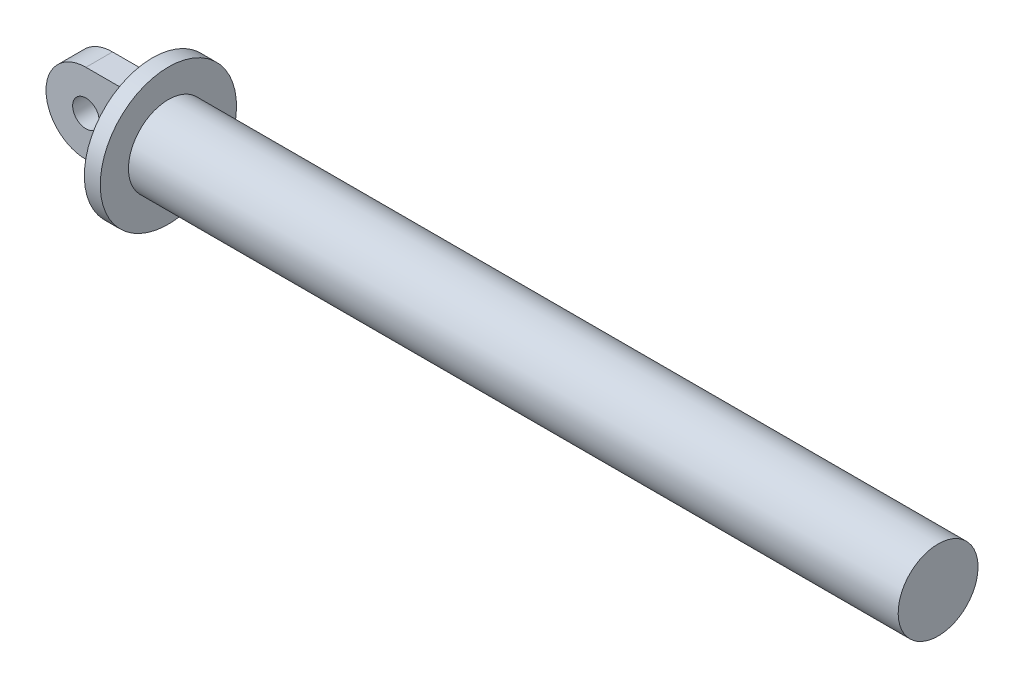
ISO-10303-21;
HEADER;
FILE_DESCRIPTION(('STEP AP214'),'2;1');
FILE_NAME('part.step','',(''),(''),'','','');
FILE_SCHEMA(('AUTOMOTIVE_DESIGN { 1 0 10303 214 1 1 1 1 }'));
ENDSEC;
DATA;
#1=APPLICATION_CONTEXT('core data for automotive mechanical design processes');
#2=APPLICATION_PROTOCOL_DEFINITION('international standard','automotive_design',2000,#1);
#3=PRODUCT_CONTEXT('',#1,'mechanical');
#4=PRODUCT('Part','Part','',(#3));
#5=PRODUCT_RELATED_PRODUCT_CATEGORY('part','',(#4));
#6=PRODUCT_DEFINITION_FORMATION('','',#4);
#7=PRODUCT_DEFINITION_CONTEXT('part definition',#1,'design');
#8=PRODUCT_DEFINITION('design','',#6,#7);
#9=PRODUCT_DEFINITION_SHAPE('','',#8);
#10=(LENGTH_UNIT() NAMED_UNIT(*) SI_UNIT(.MILLI.,.METRE.));
#11=(NAMED_UNIT(*) PLANE_ANGLE_UNIT() SI_UNIT($,.RADIAN.));
#12=(NAMED_UNIT(*) SI_UNIT($,.STERADIAN.) SOLID_ANGLE_UNIT());
#13=UNCERTAINTY_MEASURE_WITH_UNIT(LENGTH_MEASURE(1.E-05),#10,'distance_accuracy_value','');
#14=(GEOMETRIC_REPRESENTATION_CONTEXT(3) GLOBAL_UNCERTAINTY_ASSIGNED_CONTEXT((#13)) GLOBAL_UNIT_ASSIGNED_CONTEXT((#10,
#11,#12)) REPRESENTATION_CONTEXT('',''));
#15=CARTESIAN_POINT('',(0.,0.,0.));
#16=DIRECTION('',(0.,0.,1.));
#17=DIRECTION('',(1.,0.,0.));
#18=AXIS2_PLACEMENT_3D('',#15,#16,#17);
#19=CARTESIAN_POINT('',(-25.9823415505556,13.4020243973581,5.));
#20=DIRECTION('',(0.,0.,1.));
#21=DIRECTION('',(1.,0.,0.));
#22=AXIS2_PLACEMENT_3D('',#19,#20,#21);
#23=PLANE('',#22);
#24=CARTESIAN_POINT('',(-25.9823415505556,13.4020243973581,5.));
#25=DIRECTION('',(0.,0.,1.));
#26=DIRECTION('',(1.,0.,0.));
#27=AXIS2_PLACEMENT_3D('',#24,#25,#26);
#28=CIRCLE('',#27,15.);
#29=CARTESIAN_POINT('',(-25.9823415505556,28.4020243973581,5.));
#30=VERTEX_POINT('',#29);
#31=CARTESIAN_POINT('',(-25.9823415505556,-1.59797560264188,5.));
#32=VERTEX_POINT('',#31);
#33=EDGE_CURVE('E103',#30,#32,#28,.T.);
#34=ORIENTED_EDGE('',*,*,#33,.T.);
#35=DIRECTION('',(1.,0.,0.));
#36=VECTOR('',#35,1.);
#37=CARTESIAN_POINT('',(-25.9823415505556,-1.59797560264188,5.));
#38=LINE('',#37,#36);
#39=CARTESIAN_POINT('',(-5.9823415505556,-1.59797560264188,5.));
#40=VERTEX_POINT('',#39);
#41=EDGE_CURVE('E76',#32,#40,#38,.T.);
#42=ORIENTED_EDGE('',*,*,#41,.T.);
#43=DIRECTION('',(0.,1.,0.));
#44=VECTOR('',#43,1.);
#45=CARTESIAN_POINT('',(-5.98234155055561,28.4020243973581,5.));
#46=LINE('',#45,#44);
#47=CARTESIAN_POINT('',(-5.98234155055561,28.4020243973581,5.));
#48=VERTEX_POINT('',#47);
#49=EDGE_CURVE('E98',#40,#48,#46,.T.);
#50=ORIENTED_EDGE('',*,*,#49,.T.);
#51=DIRECTION('',(-1.,0.,0.));
#52=VECTOR('',#51,1.);
#53=CARTESIAN_POINT('',(-25.9823415505556,28.4020243973581,5.));
#54=LINE('',#53,#52);
#55=EDGE_CURVE('E52',#48,#30,#54,.T.);
#56=ORIENTED_EDGE('',*,*,#55,.T.);
#57=EDGE_LOOP('',(#34,#42,#50,#56));
#58=FACE_BOUND('',#57,.T.);
#59=CARTESIAN_POINT('',(-25.9823415505556,13.4020243973581,5.));
#60=DIRECTION('',(0.,0.,1.));
#61=DIRECTION('',(1.,0.,0.));
#62=AXIS2_PLACEMENT_3D('',#59,#60,#61);
#63=CIRCLE('',#62,5.);
#64=CARTESIAN_POINT('',(-20.9823415505556,13.4020243973581,5.));
#65=VERTEX_POINT('',#64);
#66=EDGE_CURVE('E106',#65,#65,#63,.T.);
#67=ORIENTED_EDGE('',*,*,#66,.F.);
#68=EDGE_LOOP('',(#67));
#69=FACE_BOUND('',#68,.T.);
#70=ADVANCED_FACE('F35',(#58,#69),#23,.T.);
#71=CARTESIAN_POINT('',(-25.9823415505556,13.4020243973581,-5.));
#72=DIRECTION('',(0.,0.,1.));
#73=DIRECTION('',(1.,0.,0.));
#74=AXIS2_PLACEMENT_3D('',#71,#72,#73);
#75=PLANE('',#74);
#76=CARTESIAN_POINT('',(-25.9823415505556,13.4020243973581,-5.));
#77=DIRECTION('',(0.,0.,1.));
#78=DIRECTION('',(1.,0.,0.));
#79=AXIS2_PLACEMENT_3D('',#76,#77,#78);
#80=CIRCLE('',#79,15.);
#81=CARTESIAN_POINT('',(-25.9823415505556,28.4020243973581,-5.));
#82=VERTEX_POINT('',#81);
#83=CARTESIAN_POINT('',(-25.9823415505556,-1.59797560264188,-5.));
#84=VERTEX_POINT('',#83);
#85=EDGE_CURVE('E94',#82,#84,#80,.T.);
#86=ORIENTED_EDGE('',*,*,#85,.F.);
#87=DIRECTION('',(-1.,0.,0.));
#88=VECTOR('',#87,1.);
#89=CARTESIAN_POINT('',(-25.9823415505556,28.4020243973581,-5.));
#90=LINE('',#89,#88);
#91=CARTESIAN_POINT('',(-5.98234155055561,28.4020243973581,-5.));
#92=VERTEX_POINT('',#91);
#93=EDGE_CURVE('E69',#92,#82,#90,.T.);
#94=ORIENTED_EDGE('',*,*,#93,.F.);
#95=DIRECTION('',(0.,1.,0.));
#96=VECTOR('',#95,1.);
#97=CARTESIAN_POINT('',(-5.98234155055561,28.4020243973581,-5.));
#98=LINE('',#97,#96);
#99=CARTESIAN_POINT('',(-5.9823415505556,-1.59797560264188,-5.));
#100=VERTEX_POINT('',#99);
#101=EDGE_CURVE('E81',#100,#92,#98,.T.);
#102=ORIENTED_EDGE('',*,*,#101,.F.);
#103=DIRECTION('',(1.,0.,0.));
#104=VECTOR('',#103,1.);
#105=CARTESIAN_POINT('',(-25.9823415505556,-1.59797560264188,-5.));
#106=LINE('',#105,#104);
#107=EDGE_CURVE('E86',#84,#100,#106,.T.);
#108=ORIENTED_EDGE('',*,*,#107,.F.);
#109=EDGE_LOOP('',(#86,#94,#102,#108));
#110=FACE_BOUND('',#109,.T.);
#111=CARTESIAN_POINT('',(-25.9823415505556,13.4020243973581,-5.));
#112=DIRECTION('',(0.,0.,1.));
#113=DIRECTION('',(1.,0.,0.));
#114=AXIS2_PLACEMENT_3D('',#111,#112,#113);
#115=CIRCLE('',#114,5.);
#116=CARTESIAN_POINT('',(-20.9823415505556,13.4020243973581,-5.));
#117=VERTEX_POINT('',#116);
#118=EDGE_CURVE('E111',#117,#117,#115,.T.);
#119=ORIENTED_EDGE('',*,*,#118,.T.);
#120=EDGE_LOOP('',(#119));
#121=FACE_BOUND('',#120,.T.);
#122=ADVANCED_FACE('F84',(#110,#121),#75,.F.);
#123=CARTESIAN_POINT('',(-25.9823415505556,13.4020243973581,5.));
#124=DIRECTION('',(0.,0.,-1.));
#125=DIRECTION('',(-1.,0.,0.));
#126=AXIS2_PLACEMENT_3D('',#123,#124,#125);
#127=CYLINDRICAL_SURFACE('',#126,15.);
#128=ORIENTED_EDGE('',*,*,#85,.T.);
#129=DIRECTION('',(0.,0.,-1.));
#130=VECTOR('',#129,1.);
#131=CARTESIAN_POINT('',(-25.9823415505556,-1.59797560264188,5.));
#132=LINE('',#131,#130);
#133=EDGE_CURVE('E11',#32,#84,#132,.T.);
#134=ORIENTED_EDGE('',*,*,#133,.F.);
#135=ORIENTED_EDGE('',*,*,#33,.F.);
#136=DIRECTION('',(0.,0.,-1.));
#137=VECTOR('',#136,1.);
#138=CARTESIAN_POINT('',(-25.9823415505556,28.4020243973581,5.));
#139=LINE('',#138,#137);
#140=EDGE_CURVE('E99',#30,#82,#139,.T.);
#141=ORIENTED_EDGE('',*,*,#140,.T.);
#142=EDGE_LOOP('',(#128,#134,#135,#141));
#143=FACE_BOUND('',#142,.T.);
#144=ADVANCED_FACE('F37',(#143),#127,.T.);
#145=CARTESIAN_POINT('',(-25.9823415505556,-1.59797560264188,5.));
#146=DIRECTION('',(0.,1.,0.));
#147=DIRECTION('',(0.,0.,1.));
#148=AXIS2_PLACEMENT_3D('',#145,#146,#147);
#149=PLANE('',#148);
#150=ORIENTED_EDGE('',*,*,#107,.T.);
#151=DIRECTION('',(0.,0.,-1.));
#152=VECTOR('',#151,1.);
#153=CARTESIAN_POINT('',(-5.9823415505556,-1.59797560264188,5.));
#154=LINE('',#153,#152);
#155=EDGE_CURVE('E44',#40,#100,#154,.T.);
#156=ORIENTED_EDGE('',*,*,#155,.F.);
#157=ORIENTED_EDGE('',*,*,#41,.F.);
#158=ORIENTED_EDGE('',*,*,#133,.T.);
#159=EDGE_LOOP('',(#150,#156,#157,#158));
#160=FACE_BOUND('',#159,.T.);
#161=ADVANCED_FACE('F90',(#160),#149,.F.);
#162=CARTESIAN_POINT('',(-25.9823415505556,28.4020243973581,5.));
#163=DIRECTION('',(0.,-1.,0.));
#164=DIRECTION('',(0.,0.,-1.));
#165=AXIS2_PLACEMENT_3D('',#162,#163,#164);
#166=PLANE('',#165);
#167=ORIENTED_EDGE('',*,*,#93,.T.);
#168=ORIENTED_EDGE('',*,*,#140,.F.);
#169=ORIENTED_EDGE('',*,*,#55,.F.);
#170=DIRECTION('',(0.,0.,-1.));
#171=VECTOR('',#170,1.);
#172=CARTESIAN_POINT('',(-5.98234155055561,28.4020243973581,5.));
#173=LINE('',#172,#171);
#174=EDGE_CURVE('E66',#48,#92,#173,.T.);
#175=ORIENTED_EDGE('',*,*,#174,.T.);
#176=EDGE_LOOP('',(#167,#168,#169,#175));
#177=FACE_BOUND('',#176,.T.);
#178=ADVANCED_FACE('F155',(#177),#166,.F.);
#179=CARTESIAN_POINT('',(-25.9823415505556,13.4020243973581,5.));
#180=DIRECTION('',(0.,0.,-1.));
#181=DIRECTION('',(-1.,0.,0.));
#182=AXIS2_PLACEMENT_3D('',#179,#180,#181);
#183=CYLINDRICAL_SURFACE('',#182,5.);
#184=ORIENTED_EDGE('',*,*,#66,.T.);
#185=EDGE_LOOP('',(#184));
#186=FACE_BOUND('',#185,.T.);
#187=ORIENTED_EDGE('',*,*,#118,.F.);
#188=EDGE_LOOP('',(#187));
#189=FACE_BOUND('',#188,.T.);
#190=ADVANCED_FACE('F152',(#186,#189),#183,.F.);
#191=CARTESIAN_POINT('',(-5.98234155055561,28.4020243973581,0.));
#192=DIRECTION('',(-1.,0.,0.));
#193=DIRECTION('',(0.,-1.,0.));
#194=AXIS2_PLACEMENT_3D('',#191,#192,#193);
#195=PLANE('',#194);
#196=ORIENTED_EDGE('',*,*,#155,.T.);
#197=ORIENTED_EDGE('',*,*,#101,.T.);
#198=ORIENTED_EDGE('',*,*,#174,.F.);
#199=ORIENTED_EDGE('',*,*,#49,.F.);
#200=EDGE_LOOP('',(#196,#197,#198,#199));
#201=FACE_BOUND('',#200,.T.);
#202=CARTESIAN_POINT('',(-5.9823415505556,13.4020243973581,0.));
#203=DIRECTION('',(1.,0.,0.));
#204=DIRECTION('',(0.,1.,0.));
#205=AXIS2_PLACEMENT_3D('',#202,#203,#204);
#206=CIRCLE('',#205,25.5979756026419);
#207=CARTESIAN_POINT('',(-5.98234155055561,39.,0.));
#208=VERTEX_POINT('',#207);
#209=EDGE_CURVE('E114',#208,#208,#206,.T.);
#210=ORIENTED_EDGE('',*,*,#209,.F.);
#211=EDGE_LOOP('',(#210));
#212=FACE_BOUND('',#211,.T.);
#213=ADVANCED_FACE('F96',(#201,#212),#195,.T.);
#214=CARTESIAN_POINT('',(289.215653404883,13.4020243973582,0.));
#215=DIRECTION('',(1.,0.,0.));
#216=DIRECTION('',(0.,1.,0.));
#217=AXIS2_PLACEMENT_3D('',#214,#215,#216);
#218=CYLINDRICAL_SURFACE('',#217,25.5979756026419);
#219=ORIENTED_EDGE('',*,*,#209,.T.);
#220=EDGE_LOOP('',(#219));
#221=FACE_BOUND('',#220,.T.);
#222=CARTESIAN_POINT('',(0.,13.4020243973581,0.));
#223=DIRECTION('',(1.,0.,0.));
#224=DIRECTION('',(0.,1.,0.));
#225=AXIS2_PLACEMENT_3D('',#222,#223,#224);
#226=CIRCLE('',#225,25.5979756026419);
#227=CARTESIAN_POINT('',(0.,39.,0.));
#228=VERTEX_POINT('',#227);
#229=EDGE_CURVE('E119',#228,#228,#226,.T.);
#230=ORIENTED_EDGE('',*,*,#229,.F.);
#231=EDGE_LOOP('',(#230));
#232=FACE_BOUND('',#231,.T.);
#233=ADVANCED_FACE('F141',(#221,#232),#218,.T.);
#234=CARTESIAN_POINT('',(0.,39.,0.));
#235=DIRECTION('',(1.,0.,0.));
#236=DIRECTION('',(0.,1.,0.));
#237=AXIS2_PLACEMENT_3D('',#234,#235,#236);
#238=PLANE('',#237);
#239=ORIENTED_EDGE('',*,*,#229,.T.);
#240=EDGE_LOOP('',(#239));
#241=FACE_BOUND('',#240,.T.);
#242=CARTESIAN_POINT('',(0.,13.4020243973581,0.));
#243=DIRECTION('',(1.,0.,0.));
#244=DIRECTION('',(0.,1.,0.));
#245=AXIS2_PLACEMENT_3D('',#242,#243,#244);
#246=CIRCLE('',#245,15.);
#247=CARTESIAN_POINT('',(0.,28.4020243973581,0.));
#248=VERTEX_POINT('',#247);
#249=EDGE_CURVE('E122',#248,#248,#246,.T.);
#250=ORIENTED_EDGE('',*,*,#249,.F.);
#251=EDGE_LOOP('',(#250));
#252=FACE_BOUND('',#251,.T.);
#253=ADVANCED_FACE('F133',(#241,#252),#238,.T.);
#254=CARTESIAN_POINT('',(289.215653404883,13.4020243973582,0.));
#255=DIRECTION('',(1.,0.,0.));
#256=DIRECTION('',(0.,1.,0.));
#257=AXIS2_PLACEMENT_3D('',#254,#255,#256);
#258=CYLINDRICAL_SURFACE('',#257,15.);
#259=ORIENTED_EDGE('',*,*,#249,.T.);
#260=EDGE_LOOP('',(#259));
#261=FACE_BOUND('',#260,.T.);
#262=CARTESIAN_POINT('',(289.215653404883,13.4020243973582,0.));
#263=DIRECTION('',(1.,0.,0.));
#264=DIRECTION('',(0.,1.,0.));
#265=AXIS2_PLACEMENT_3D('',#262,#263,#264);
#266=CIRCLE('',#265,15.);
#267=CARTESIAN_POINT('',(289.215653404883,28.4020243973581,0.));
#268=VERTEX_POINT('',#267);
#269=EDGE_CURVE('E125',#268,#268,#266,.T.);
#270=ORIENTED_EDGE('',*,*,#269,.F.);
#271=EDGE_LOOP('',(#270));
#272=FACE_BOUND('',#271,.T.);
#273=ADVANCED_FACE('F131',(#261,#272),#258,.T.);
#274=CARTESIAN_POINT('',(289.215653404883,28.4020243973581,0.));
#275=DIRECTION('',(1.,0.,0.));
#276=DIRECTION('',(0.,1.,0.));
#277=AXIS2_PLACEMENT_3D('',#274,#275,#276);
#278=PLANE('',#277);
#279=ORIENTED_EDGE('',*,*,#269,.T.);
#280=EDGE_LOOP('',(#279));
#281=FACE_BOUND('',#280,.T.);
#282=ADVANCED_FACE('F129',(#281),#278,.T.);
#283=CLOSED_SHELL('',(#70,#122,#144,#161,#178,#190,#213,#233,#253,#273,#282));
#284=MANIFOLD_SOLID_BREP('B2',#283);
#285=ADVANCED_BREP_SHAPE_REPRESENTATION('',(#18,#284),#14);
#286=SHAPE_DEFINITION_REPRESENTATION(#9,#285);
ENDSEC;
END-ISO-10303-21;
